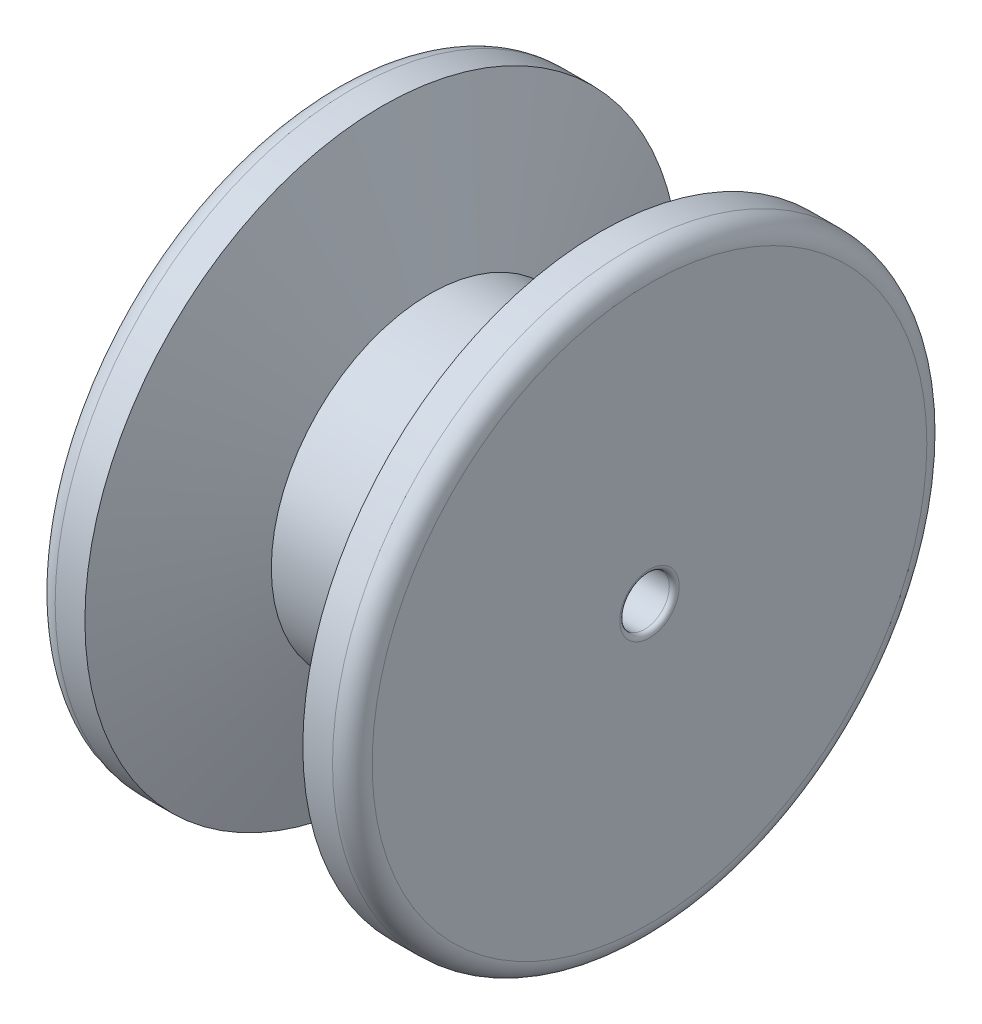
ISO-10303-21;
HEADER;
FILE_DESCRIPTION(('STEP AP214'),'2;1');
FILE_NAME('part.step','',(''),(''),'','','');
FILE_SCHEMA(('AUTOMOTIVE_DESIGN { 1 0 10303 214 1 1 1 1 }'));
ENDSEC;
DATA;
#1=APPLICATION_CONTEXT('core data for automotive mechanical design processes');
#2=APPLICATION_PROTOCOL_DEFINITION('international standard','automotive_design',2000,#1);
#3=PRODUCT_CONTEXT('',#1,'mechanical');
#4=PRODUCT('Part','Part','',(#3));
#5=PRODUCT_RELATED_PRODUCT_CATEGORY('part','',(#4));
#6=PRODUCT_DEFINITION_FORMATION('','',#4);
#7=PRODUCT_DEFINITION_CONTEXT('part definition',#1,'design');
#8=PRODUCT_DEFINITION('design','',#6,#7);
#9=PRODUCT_DEFINITION_SHAPE('','',#8);
#10=(LENGTH_UNIT() NAMED_UNIT(*) SI_UNIT(.MILLI.,.METRE.));
#11=(NAMED_UNIT(*) PLANE_ANGLE_UNIT() SI_UNIT($,.RADIAN.));
#12=(NAMED_UNIT(*) SI_UNIT($,.STERADIAN.) SOLID_ANGLE_UNIT());
#13=UNCERTAINTY_MEASURE_WITH_UNIT(LENGTH_MEASURE(1.E-05),#10,'distance_accuracy_value','');
#14=(GEOMETRIC_REPRESENTATION_CONTEXT(3) GLOBAL_UNCERTAINTY_ASSIGNED_CONTEXT((#13)) GLOBAL_UNIT_ASSIGNED_CONTEXT((#10,
#11,#12)) REPRESENTATION_CONTEXT('',''));
#15=CARTESIAN_POINT('',(0.,0.,0.));
#16=DIRECTION('',(0.,0.,1.));
#17=DIRECTION('',(1.,0.,0.));
#18=AXIS2_PLACEMENT_3D('',#15,#16,#17);
#19=CARTESIAN_POINT('',(-29.0315789473684,0.,0.));
#20=DIRECTION('',(-1.,0.,0.));
#21=DIRECTION('',(0.,0.,1.));
#22=AXIS2_PLACEMENT_3D('',#19,#20,#21);
#23=CYLINDRICAL_SURFACE('',#22,2.5);
#24=CARTESIAN_POINT('',(-15.5,0.,0.));
#25=DIRECTION('',(1.,0.,0.));
#26=DIRECTION('',(0.,0.,-1.));
#27=AXIS2_PLACEMENT_3D('',#24,#25,#26);
#28=CIRCLE('',#27,2.5);
#29=CARTESIAN_POINT('',(-15.5,0.,-2.5));
#30=VERTEX_POINT('',#29);
#31=EDGE_CURVE('E56',#30,#30,#28,.F.);
#32=ORIENTED_EDGE('',*,*,#31,.T.);
#33=EDGE_LOOP('',(#32));
#34=FACE_BOUND('',#33,.T.);
#35=CARTESIAN_POINT('',(15.5,0.,0.));
#36=DIRECTION('',(1.,0.,0.));
#37=DIRECTION('',(0.,0.,-1.));
#38=AXIS2_PLACEMENT_3D('',#35,#36,#37);
#39=CIRCLE('',#38,2.5);
#40=CARTESIAN_POINT('',(15.5,0.,-2.5));
#41=VERTEX_POINT('',#40);
#42=EDGE_CURVE('E78',#41,#41,#39,.F.);
#43=ORIENTED_EDGE('',*,*,#42,.F.);
#44=EDGE_LOOP('',(#43));
#45=FACE_BOUND('',#44,.T.);
#46=ADVANCED_FACE('F49',(#34,#45),#23,.F.);
#47=CARTESIAN_POINT('',(-16.,2.5,0.));
#48=DIRECTION('',(1.,0.,0.));
#49=DIRECTION('',(0.,0.,-1.));
#50=AXIS2_PLACEMENT_3D('',#47,#48,#49);
#51=PLANE('',#50);
#52=CARTESIAN_POINT('',(-16.,0.,0.));
#53=DIRECTION('',(1.,0.,0.));
#54=DIRECTION('',(0.,0.,-1.));
#55=AXIS2_PLACEMENT_3D('',#52,#53,#54);
#56=CIRCLE('',#55,3.);
#57=CARTESIAN_POINT('',(-16.,0.,-3.));
#58=VERTEX_POINT('',#57);
#59=EDGE_CURVE('E11',#58,#58,#56,.T.);
#60=ORIENTED_EDGE('',*,*,#59,.T.);
#61=EDGE_LOOP('',(#60));
#62=FACE_BOUND('',#61,.T.);
#63=CARTESIAN_POINT('',(-16.,0.,0.));
#64=DIRECTION('',(1.,0.,0.));
#65=DIRECTION('',(0.,0.,-1.));
#66=AXIS2_PLACEMENT_3D('',#63,#64,#65);
#67=CIRCLE('',#66,28.);
#68=CARTESIAN_POINT('',(-16.,0.,-28.));
#69=VERTEX_POINT('',#68);
#70=EDGE_CURVE('E64',#69,#69,#67,.F.);
#71=ORIENTED_EDGE('',*,*,#70,.T.);
#72=EDGE_LOOP('',(#71));
#73=FACE_BOUND('',#72,.T.);
#74=ADVANCED_FACE('F113',(#62,#73),#51,.F.);
#75=CARTESIAN_POINT('',(-29.0315789473684,0.,0.));
#76=DIRECTION('',(-1.,0.,0.));
#77=DIRECTION('',(0.,0.,1.));
#78=AXIS2_PLACEMENT_3D('',#75,#76,#77);
#79=CYLINDRICAL_SURFACE('',#78,30.);
#80=CARTESIAN_POINT('',(-14.,0.,0.));
#81=DIRECTION('',(1.,0.,0.));
#82=DIRECTION('',(0.,0.,-1.));
#83=AXIS2_PLACEMENT_3D('',#80,#81,#82);
#84=CIRCLE('',#83,30.);
#85=CARTESIAN_POINT('',(-14.,0.,-30.));
#86=VERTEX_POINT('',#85);
#87=EDGE_CURVE('E60',#86,#86,#84,.T.);
#88=ORIENTED_EDGE('',*,*,#87,.T.);
#89=EDGE_LOOP('',(#88));
#90=FACE_BOUND('',#89,.T.);
#91=CARTESIAN_POINT('',(-11.,0.,0.));
#92=DIRECTION('',(-1.,0.,0.));
#93=DIRECTION('',(0.,0.,1.));
#94=AXIS2_PLACEMENT_3D('',#91,#92,#93);
#95=CIRCLE('',#94,30.);
#96=CARTESIAN_POINT('',(-11.,0.,30.));
#97=VERTEX_POINT('',#96);
#98=EDGE_CURVE('E69',#97,#97,#95,.T.);
#99=ORIENTED_EDGE('',*,*,#98,.T.);
#100=EDGE_LOOP('',(#99));
#101=FACE_BOUND('',#100,.T.);
#102=ADVANCED_FACE('F120',(#90,#101),#79,.T.);
#103=CARTESIAN_POINT('',(-6.17941341394473,0.,0.));
#104=DIRECTION('',(-1.,0.,0.));
#105=DIRECTION('',(0.,0.,1.));
#106=AXIS2_PLACEMENT_3D('',#103,#104,#105);
#107=CONICAL_SURFACE('',#106,16.,1.23918376891598);
#108=ORIENTED_EDGE('',*,*,#98,.F.);
#109=EDGE_LOOP('',(#108));
#110=FACE_BOUND('',#109,.T.);
#111=CARTESIAN_POINT('',(-6.17941341394473,0.,0.));
#112=DIRECTION('',(-1.,0.,0.));
#113=DIRECTION('',(0.,0.,1.));
#114=AXIS2_PLACEMENT_3D('',#111,#112,#113);
#115=CIRCLE('',#114,16.);
#116=CARTESIAN_POINT('',(-6.17941341394473,0.,16.));
#117=VERTEX_POINT('',#116);
#118=EDGE_CURVE('E72',#117,#117,#115,.T.);
#119=ORIENTED_EDGE('',*,*,#118,.T.);
#120=EDGE_LOOP('',(#119));
#121=FACE_BOUND('',#120,.T.);
#122=ADVANCED_FACE('F132',(#110,#121),#107,.T.);
#123=CARTESIAN_POINT('',(-29.0315789473684,0.,0.));
#124=DIRECTION('',(-1.,0.,0.));
#125=DIRECTION('',(0.,0.,1.));
#126=AXIS2_PLACEMENT_3D('',#123,#124,#125);
#127=CYLINDRICAL_SURFACE('',#126,16.);
#128=ORIENTED_EDGE('',*,*,#118,.F.);
#129=EDGE_LOOP('',(#128));
#130=FACE_BOUND('',#129,.T.);
#131=CARTESIAN_POINT('',(6.17941341394473,0.,0.));
#132=DIRECTION('',(-1.,0.,0.));
#133=DIRECTION('',(0.,0.,1.));
#134=AXIS2_PLACEMENT_3D('',#131,#132,#133);
#135=CIRCLE('',#134,16.);
#136=CARTESIAN_POINT('',(6.17941341394473,0.,16.));
#137=VERTEX_POINT('',#136);
#138=EDGE_CURVE('E90',#137,#137,#135,.T.);
#139=ORIENTED_EDGE('',*,*,#138,.T.);
#140=EDGE_LOOP('',(#139));
#141=FACE_BOUND('',#140,.T.);
#142=ADVANCED_FACE('F94',(#130,#141),#127,.T.);
#143=CARTESIAN_POINT('',(-14.,0.,0.));
#144=DIRECTION('',(1.,0.,0.));
#145=DIRECTION('',(0.,0.,-1.));
#146=AXIS2_PLACEMENT_3D('',#143,#144,#145);
#147=TOROIDAL_SURFACE('',#146,28.,2.);
#148=ORIENTED_EDGE('',*,*,#87,.F.);
#149=EDGE_LOOP('',(#148));
#150=FACE_BOUND('',#149,.T.);
#151=ORIENTED_EDGE('',*,*,#70,.F.);
#152=EDGE_LOOP('',(#151));
#153=FACE_BOUND('',#152,.T.);
#154=ADVANCED_FACE('F124',(#150,#153),#147,.T.);
#155=CARTESIAN_POINT('',(-15.5,0.,0.));
#156=DIRECTION('',(1.,0.,0.));
#157=DIRECTION('',(0.,0.,-1.));
#158=AXIS2_PLACEMENT_3D('',#155,#156,#157);
#159=TOROIDAL_SURFACE('',#158,3.,0.5);
#160=ORIENTED_EDGE('',*,*,#59,.F.);
#161=EDGE_LOOP('',(#160));
#162=FACE_BOUND('',#161,.T.);
#163=ORIENTED_EDGE('',*,*,#31,.F.);
#164=EDGE_LOOP('',(#163));
#165=FACE_BOUND('',#164,.T.);
#166=ADVANCED_FACE('F51',(#162,#165),#159,.T.);
#167=CARTESIAN_POINT('',(16.,2.5,0.));
#168=DIRECTION('',(-1.,0.,0.));
#169=DIRECTION('',(0.,0.,-1.));
#170=AXIS2_PLACEMENT_3D('',#167,#168,#169);
#171=PLANE('',#170);
#172=CARTESIAN_POINT('',(16.,0.,0.));
#173=DIRECTION('',(1.,0.,0.));
#174=DIRECTION('',(0.,0.,-1.));
#175=AXIS2_PLACEMENT_3D('',#172,#173,#174);
#176=CIRCLE('',#175,3.);
#177=CARTESIAN_POINT('',(16.,0.,-3.));
#178=VERTEX_POINT('',#177);
#179=EDGE_CURVE('E75',#178,#178,#176,.T.);
#180=ORIENTED_EDGE('',*,*,#179,.F.);
#181=EDGE_LOOP('',(#180));
#182=FACE_BOUND('',#181,.T.);
#183=CARTESIAN_POINT('',(16.,0.,0.));
#184=DIRECTION('',(1.,0.,0.));
#185=DIRECTION('',(0.,0.,-1.));
#186=AXIS2_PLACEMENT_3D('',#183,#184,#185);
#187=CIRCLE('',#186,28.);
#188=CARTESIAN_POINT('',(16.,0.,-28.));
#189=VERTEX_POINT('',#188);
#190=EDGE_CURVE('E84',#189,#189,#187,.F.);
#191=ORIENTED_EDGE('',*,*,#190,.F.);
#192=EDGE_LOOP('',(#191));
#193=FACE_BOUND('',#192,.T.);
#194=ADVANCED_FACE('F109',(#182,#193),#171,.F.);
#195=CARTESIAN_POINT('',(29.0315789473684,0.,0.));
#196=DIRECTION('',(1.,0.,0.));
#197=DIRECTION('',(0.,0.,1.));
#198=AXIS2_PLACEMENT_3D('',#195,#196,#197);
#199=CYLINDRICAL_SURFACE('',#198,30.);
#200=CARTESIAN_POINT('',(14.,0.,0.));
#201=DIRECTION('',(1.,0.,0.));
#202=DIRECTION('',(0.,0.,-1.));
#203=AXIS2_PLACEMENT_3D('',#200,#201,#202);
#204=CIRCLE('',#203,30.);
#205=CARTESIAN_POINT('',(14.,0.,-30.));
#206=VERTEX_POINT('',#205);
#207=EDGE_CURVE('E81',#206,#206,#204,.T.);
#208=ORIENTED_EDGE('',*,*,#207,.F.);
#209=EDGE_LOOP('',(#208));
#210=FACE_BOUND('',#209,.T.);
#211=CARTESIAN_POINT('',(11.,0.,0.));
#212=DIRECTION('',(-1.,0.,0.));
#213=DIRECTION('',(0.,0.,1.));
#214=AXIS2_PLACEMENT_3D('',#211,#212,#213);
#215=CIRCLE('',#214,30.);
#216=CARTESIAN_POINT('',(11.,0.,30.));
#217=VERTEX_POINT('',#216);
#218=EDGE_CURVE('E87',#217,#217,#215,.T.);
#219=ORIENTED_EDGE('',*,*,#218,.F.);
#220=EDGE_LOOP('',(#219));
#221=FACE_BOUND('',#220,.T.);
#222=ADVANCED_FACE('F99',(#210,#221),#199,.T.);
#223=CARTESIAN_POINT('',(6.17941341394473,0.,0.));
#224=DIRECTION('',(1.,0.,0.));
#225=DIRECTION('',(0.,0.,1.));
#226=AXIS2_PLACEMENT_3D('',#223,#224,#225);
#227=CONICAL_SURFACE('',#226,16.,1.23918376891598);
#228=ORIENTED_EDGE('',*,*,#218,.T.);
#229=EDGE_LOOP('',(#228));
#230=FACE_BOUND('',#229,.T.);
#231=ORIENTED_EDGE('',*,*,#138,.F.);
#232=EDGE_LOOP('',(#231));
#233=FACE_BOUND('',#232,.T.);
#234=ADVANCED_FACE('F96',(#230,#233),#227,.T.);
#235=CARTESIAN_POINT('',(14.,0.,0.));
#236=DIRECTION('',(-1.,0.,0.));
#237=DIRECTION('',(0.,0.,-1.));
#238=AXIS2_PLACEMENT_3D('',#235,#236,#237);
#239=TOROIDAL_SURFACE('',#238,28.,2.);
#240=ORIENTED_EDGE('',*,*,#207,.T.);
#241=EDGE_LOOP('',(#240));
#242=FACE_BOUND('',#241,.T.);
#243=ORIENTED_EDGE('',*,*,#190,.T.);
#244=EDGE_LOOP('',(#243));
#245=FACE_BOUND('',#244,.T.);
#246=ADVANCED_FACE('F98',(#242,#245),#239,.T.);
#247=CARTESIAN_POINT('',(15.5,0.,0.));
#248=DIRECTION('',(-1.,0.,0.));
#249=DIRECTION('',(0.,0.,-1.));
#250=AXIS2_PLACEMENT_3D('',#247,#248,#249);
#251=TOROIDAL_SURFACE('',#250,3.,0.5);
#252=ORIENTED_EDGE('',*,*,#179,.T.);
#253=EDGE_LOOP('',(#252));
#254=FACE_BOUND('',#253,.T.);
#255=ORIENTED_EDGE('',*,*,#42,.T.);
#256=EDGE_LOOP('',(#255));
#257=FACE_BOUND('',#256,.T.);
#258=ADVANCED_FACE('F106',(#254,#257),#251,.T.);
#259=CLOSED_SHELL('',(#46,#74,#102,#122,#142,#154,#166,#194,#222,#234,#246,#258));
#260=MANIFOLD_SOLID_BREP('B2',#259);
#261=ADVANCED_BREP_SHAPE_REPRESENTATION('',(#18,#260),#14);
#262=SHAPE_DEFINITION_REPRESENTATION(#9,#261);
ENDSEC;
END-ISO-10303-21;
